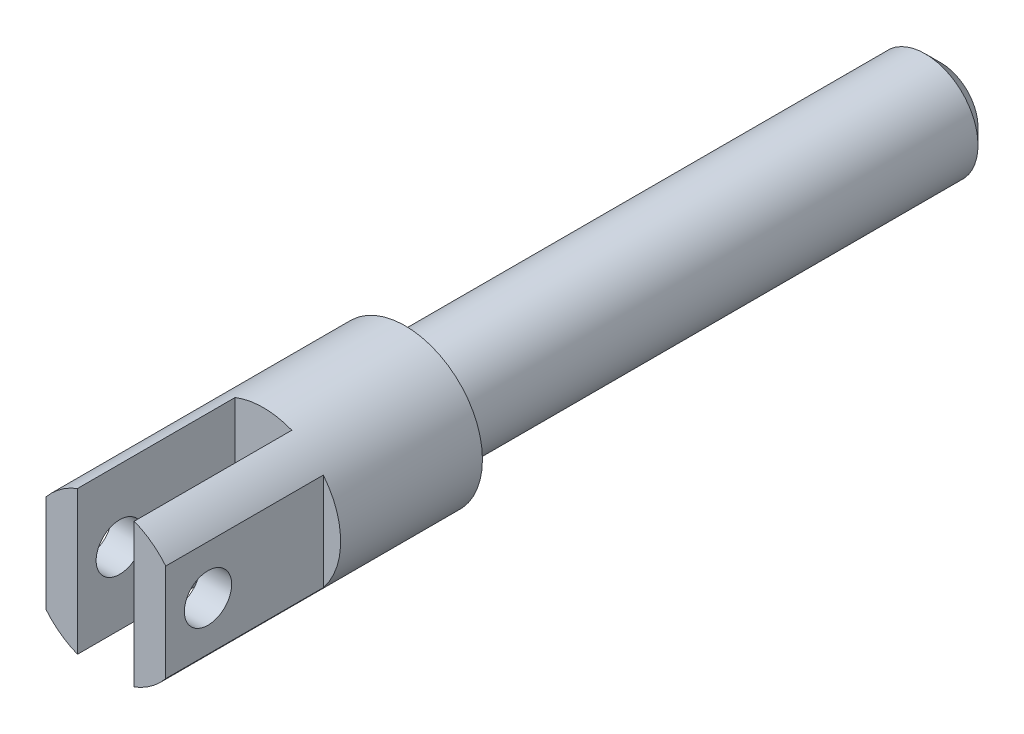
ISO-10303-21;
HEADER;
FILE_DESCRIPTION(('STEP AP214'),'2;1');
FILE_NAME('part.step','',(''),(''),'','','');
FILE_SCHEMA(('AUTOMOTIVE_DESIGN { 1 0 10303 214 1 1 1 1 }'));
ENDSEC;
DATA;
#1=APPLICATION_CONTEXT('core data for automotive mechanical design processes');
#2=APPLICATION_PROTOCOL_DEFINITION('international standard','automotive_design',2000,#1);
#3=PRODUCT_CONTEXT('',#1,'mechanical');
#4=PRODUCT('Part','Part','',(#3));
#5=PRODUCT_RELATED_PRODUCT_CATEGORY('part','',(#4));
#6=PRODUCT_DEFINITION_FORMATION('','',#4);
#7=PRODUCT_DEFINITION_CONTEXT('part definition',#1,'design');
#8=PRODUCT_DEFINITION('design','',#6,#7);
#9=PRODUCT_DEFINITION_SHAPE('','',#8);
#10=(LENGTH_UNIT() NAMED_UNIT(*) SI_UNIT(.MILLI.,.METRE.));
#11=(NAMED_UNIT(*) PLANE_ANGLE_UNIT() SI_UNIT($,.RADIAN.));
#12=(NAMED_UNIT(*) SI_UNIT($,.STERADIAN.) SOLID_ANGLE_UNIT());
#13=UNCERTAINTY_MEASURE_WITH_UNIT(LENGTH_MEASURE(1.E-05),#10,'distance_accuracy_value','');
#14=(GEOMETRIC_REPRESENTATION_CONTEXT(3) GLOBAL_UNCERTAINTY_ASSIGNED_CONTEXT((#13)) GLOBAL_UNIT_ASSIGNED_CONTEXT((#10,
#11,#12)) REPRESENTATION_CONTEXT('',''));
#15=CARTESIAN_POINT('',(0.,0.,0.));
#16=DIRECTION('',(0.,0.,1.));
#17=DIRECTION('',(1.,0.,0.));
#18=AXIS2_PLACEMENT_3D('',#15,#16,#17);
#19=CARTESIAN_POINT('',(0.,0.,0.));
#20=DIRECTION('',(0.,0.,1.));
#21=DIRECTION('',(1.,0.,0.));
#22=AXIS2_PLACEMENT_3D('',#19,#20,#21);
#23=PLANE('',#22);
#24=CARTESIAN_POINT('',(0.,0.,0.));
#25=DIRECTION('',(0.,0.,1.));
#26=DIRECTION('',(1.,0.,0.));
#27=AXIS2_PLACEMENT_3D('',#24,#25,#26);
#28=CIRCLE('',#27,4.9);
#29=CARTESIAN_POINT('',(4.9,0.,0.));
#30=VERTEX_POINT('',#29);
#31=EDGE_CURVE('E160',#30,#30,#28,.T.);
#32=ORIENTED_EDGE('',*,*,#31,.F.);
#33=EDGE_LOOP('',(#32));
#34=FACE_BOUND('',#33,.T.);
#35=CARTESIAN_POINT('',(0.,0.,0.));
#36=DIRECTION('',(0.,0.,1.));
#37=DIRECTION('',(1.,0.,0.));
#38=AXIS2_PLACEMENT_3D('',#35,#36,#37);
#39=CIRCLE('',#38,3.35);
#40=CARTESIAN_POINT('',(3.35,0.,0.));
#41=VERTEX_POINT('',#40);
#42=EDGE_CURVE('E181',#41,#41,#39,.F.);
#43=ORIENTED_EDGE('',*,*,#42,.F.);
#44=EDGE_LOOP('',(#43));
#45=FACE_BOUND('',#44,.T.);
#46=ADVANCED_FACE('F33',(#34,#45),#23,.F.);
#47=CARTESIAN_POINT('',(0.,0.,9.));
#48=DIRECTION('',(0.,0.,1.));
#49=DIRECTION('',(1.,0.,0.));
#50=AXIS2_PLACEMENT_3D('',#47,#48,#49);
#51=PLANE('',#50);
#52=CARTESIAN_POINT('',(0.,0.,9.));
#53=DIRECTION('',(0.,0.,1.));
#54=DIRECTION('',(1.,0.,0.));
#55=AXIS2_PLACEMENT_3D('',#52,#53,#54);
#56=CIRCLE('',#55,4.9);
#57=CARTESIAN_POINT('',(-3.8,3.09354165965161,9.));
#58=VERTEX_POINT('',#57);
#59=CARTESIAN_POINT('',(-3.8,-3.09354165965161,9.));
#60=VERTEX_POINT('',#59);
#61=EDGE_CURVE('E124',#58,#60,#56,.T.);
#62=ORIENTED_EDGE('',*,*,#61,.T.);
#63=DIRECTION('',(0.,-1.,0.));
#64=VECTOR('',#63,1.);
#65=CARTESIAN_POINT('',(-3.8,-3.09354165965161,9.));
#66=LINE('',#65,#64);
#67=EDGE_CURVE('E203',#58,#60,#66,.T.);
#68=ORIENTED_EDGE('',*,*,#67,.F.);
#69=EDGE_LOOP('',(#62,#68));
#70=FACE_BOUND('',#69,.T.);
#71=ADVANCED_FACE('F221',(#70),#51,.T.);
#72=CARTESIAN_POINT('',(1.8,4.55741154604234,9.));
#73=VERTEX_POINT('',#72);
#74=CARTESIAN_POINT('',(-1.8,4.55741154604234,9.));
#75=VERTEX_POINT('',#74);
#76=EDGE_CURVE('E173',#73,#75,#56,.T.);
#77=ORIENTED_EDGE('',*,*,#76,.T.);
#78=DIRECTION('',(0.,1.,0.));
#79=VECTOR('',#78,1.);
#80=CARTESIAN_POINT('',(-1.8,-4.55741154604234,9.));
#81=LINE('',#80,#79);
#82=CARTESIAN_POINT('',(-1.8,-4.55741154604234,9.));
#83=VERTEX_POINT('',#82);
#84=EDGE_CURVE('E117',#83,#75,#81,.T.);
#85=ORIENTED_EDGE('',*,*,#84,.F.);
#86=CARTESIAN_POINT('',(1.8,-4.55741154604234,9.));
#87=VERTEX_POINT('',#86);
#88=EDGE_CURVE('E174',#83,#87,#56,.T.);
#89=ORIENTED_EDGE('',*,*,#88,.T.);
#90=DIRECTION('',(0.,-1.,0.));
#91=VECTOR('',#90,1.);
#92=CARTESIAN_POINT('',(1.8,-4.55741154604234,9.));
#93=LINE('',#92,#91);
#94=EDGE_CURVE('E125',#73,#87,#93,.T.);
#95=ORIENTED_EDGE('',*,*,#94,.F.);
#96=EDGE_LOOP('',(#77,#85,#89,#95));
#97=FACE_BOUND('',#96,.T.);
#98=ADVANCED_FACE('F213',(#97),#51,.T.);
#99=DIRECTION('',(0.,1.,0.));
#100=VECTOR('',#99,1.);
#101=CARTESIAN_POINT('',(3.8,-3.09354165965161,9.));
#102=LINE('',#101,#100);
#103=CARTESIAN_POINT('',(3.8,-3.09354165965161,9.));
#104=VERTEX_POINT('',#103);
#105=CARTESIAN_POINT('',(3.8,3.09354165965161,9.));
#106=VERTEX_POINT('',#105);
#107=EDGE_CURVE('E55',#104,#106,#102,.T.);
#108=ORIENTED_EDGE('',*,*,#107,.F.);
#109=EDGE_CURVE('E148',#104,#106,#56,.T.);
#110=ORIENTED_EDGE('',*,*,#109,.T.);
#111=EDGE_LOOP('',(#108,#110));
#112=FACE_BOUND('',#111,.T.);
#113=ADVANCED_FACE('F228',(#112),#51,.T.);
#114=CARTESIAN_POINT('',(0.,0.,9.));
#115=DIRECTION('',(0.,0.,-1.));
#116=DIRECTION('',(-1.,0.,0.));
#117=AXIS2_PLACEMENT_3D('',#114,#115,#116);
#118=CYLINDRICAL_SURFACE('',#117,4.9);
#119=ORIENTED_EDGE('',*,*,#76,.F.);
#120=DIRECTION('',(0.,0.,-1.));
#121=VECTOR('',#120,1.);
#122=CARTESIAN_POINT('',(1.8,4.55741154604234,19.));
#123=LINE('',#122,#121);
#124=CARTESIAN_POINT('',(1.8,4.55741154604234,19.));
#125=VERTEX_POINT('',#124);
#126=EDGE_CURVE('E154',#125,#73,#123,.T.);
#127=ORIENTED_EDGE('',*,*,#126,.F.);
#128=CARTESIAN_POINT('',(0.,0.,19.));
#129=DIRECTION('',(0.,0.,1.));
#130=DIRECTION('',(1.,0.,0.));
#131=AXIS2_PLACEMENT_3D('',#128,#129,#130);
#132=CIRCLE('',#131,4.9);
#133=CARTESIAN_POINT('',(3.8,3.09354165965161,19.));
#134=VERTEX_POINT('',#133);
#135=EDGE_CURVE('E132',#134,#125,#132,.T.);
#136=ORIENTED_EDGE('',*,*,#135,.F.);
#137=DIRECTION('',(0.,0.,-1.));
#138=VECTOR('',#137,1.);
#139=CARTESIAN_POINT('',(3.8,3.09354165965161,19.));
#140=LINE('',#139,#138);
#141=EDGE_CURVE('E141',#134,#106,#140,.T.);
#142=ORIENTED_EDGE('',*,*,#141,.T.);
#143=ORIENTED_EDGE('',*,*,#109,.F.);
#144=DIRECTION('',(0.,0.,-1.));
#145=VECTOR('',#144,1.);
#146=CARTESIAN_POINT('',(3.8,-3.09354165965161,19.));
#147=LINE('',#146,#145);
#148=CARTESIAN_POINT('',(3.8,-3.09354165965161,19.));
#149=VERTEX_POINT('',#148);
#150=EDGE_CURVE('E155',#149,#104,#147,.T.);
#151=ORIENTED_EDGE('',*,*,#150,.F.);
#152=CARTESIAN_POINT('',(0.,0.,19.));
#153=DIRECTION('',(0.,0.,1.));
#154=DIRECTION('',(1.,0.,0.));
#155=AXIS2_PLACEMENT_3D('',#152,#153,#154);
#156=CIRCLE('',#155,4.9);
#157=CARTESIAN_POINT('',(1.8,-4.55741154604234,19.));
#158=VERTEX_POINT('',#157);
#159=EDGE_CURVE('E137',#158,#149,#156,.T.);
#160=ORIENTED_EDGE('',*,*,#159,.F.);
#161=DIRECTION('',(0.,0.,-1.));
#162=VECTOR('',#161,1.);
#163=CARTESIAN_POINT('',(1.8,-4.55741154604234,19.));
#164=LINE('',#163,#162);
#165=EDGE_CURVE('E151',#158,#87,#164,.T.);
#166=ORIENTED_EDGE('',*,*,#165,.T.);
#167=ORIENTED_EDGE('',*,*,#88,.F.);
#168=DIRECTION('',(0.,0.,-1.));
#169=VECTOR('',#168,1.);
#170=CARTESIAN_POINT('',(-1.8,-4.55741154604234,19.));
#171=LINE('',#170,#169);
#172=CARTESIAN_POINT('',(-1.8,-4.55741154604234,19.));
#173=VERTEX_POINT('',#172);
#174=EDGE_CURVE('E48',#173,#83,#171,.T.);
#175=ORIENTED_EDGE('',*,*,#174,.F.);
#176=CARTESIAN_POINT('',(0.,0.,19.));
#177=DIRECTION('',(0.,0.,1.));
#178=DIRECTION('',(1.,0.,0.));
#179=AXIS2_PLACEMENT_3D('',#176,#177,#178);
#180=CIRCLE('',#179,4.9);
#181=CARTESIAN_POINT('',(-3.8,-3.09354165965161,19.));
#182=VERTEX_POINT('',#181);
#183=EDGE_CURVE('E108',#182,#173,#180,.T.);
#184=ORIENTED_EDGE('',*,*,#183,.F.);
#185=DIRECTION('',(0.,0.,-1.));
#186=VECTOR('',#185,1.);
#187=CARTESIAN_POINT('',(-3.8,-3.09354165965161,19.));
#188=LINE('',#187,#186);
#189=EDGE_CURVE('E105',#182,#60,#188,.T.);
#190=ORIENTED_EDGE('',*,*,#189,.T.);
#191=ORIENTED_EDGE('',*,*,#61,.F.);
#192=DIRECTION('',(0.,0.,-1.));
#193=VECTOR('',#192,1.);
#194=CARTESIAN_POINT('',(-3.8,3.09354165965161,19.));
#195=LINE('',#194,#193);
#196=CARTESIAN_POINT('',(-3.8,3.09354165965161,19.));
#197=VERTEX_POINT('',#196);
#198=EDGE_CURVE('E102',#197,#58,#195,.T.);
#199=ORIENTED_EDGE('',*,*,#198,.F.);
#200=CARTESIAN_POINT('',(0.,0.,19.));
#201=DIRECTION('',(0.,0.,1.));
#202=DIRECTION('',(1.,0.,0.));
#203=AXIS2_PLACEMENT_3D('',#200,#201,#202);
#204=CIRCLE('',#203,4.9);
#205=CARTESIAN_POINT('',(-1.8,4.55741154604234,19.));
#206=VERTEX_POINT('',#205);
#207=EDGE_CURVE('E109',#206,#197,#204,.T.);
#208=ORIENTED_EDGE('',*,*,#207,.F.);
#209=DIRECTION('',(0.,0.,-1.));
#210=VECTOR('',#209,1.);
#211=CARTESIAN_POINT('',(-1.8,4.55741154604234,19.));
#212=LINE('',#211,#210);
#213=EDGE_CURVE('E207',#206,#75,#212,.T.);
#214=ORIENTED_EDGE('',*,*,#213,.T.);
#215=EDGE_LOOP('',(#119,#127,#136,#142,#143,#151,#160,#166,#167,#175,#184,#190,#191,#199,#208,#214));
#216=FACE_BOUND('',#215,.T.);
#217=ORIENTED_EDGE('',*,*,#31,.T.);
#218=EDGE_LOOP('',(#217));
#219=FACE_BOUND('',#218,.T.);
#220=ADVANCED_FACE('F121',(#216,#219),#118,.T.);
#221=CARTESIAN_POINT('',(1.8,-4.55741154604234,19.));
#222=DIRECTION('',(1.,0.,0.));
#223=DIRECTION('',(0.,0.,-1.));
#224=AXIS2_PLACEMENT_3D('',#221,#222,#223);
#225=PLANE('',#224);
#226=CARTESIAN_POINT('',(1.8,0.,16.3188145856226));
#227=DIRECTION('',(1.,0.,0.));
#228=DIRECTION('',(0.,0.,-1.));
#229=AXIS2_PLACEMENT_3D('',#226,#227,#228);
#230=CIRCLE('',#229,1.5);
#231=CARTESIAN_POINT('',(1.8,0.,14.8188145856226));
#232=VERTEX_POINT('',#231);
#233=EDGE_CURVE('E195',#232,#232,#230,.T.);
#234=ORIENTED_EDGE('',*,*,#233,.T.);
#235=EDGE_LOOP('',(#234));
#236=FACE_BOUND('',#235,.T.);
#237=ORIENTED_EDGE('',*,*,#94,.T.);
#238=ORIENTED_EDGE('',*,*,#165,.F.);
#239=DIRECTION('',(0.,-1.,0.));
#240=VECTOR('',#239,1.);
#241=CARTESIAN_POINT('',(1.8,-4.55741154604234,19.));
#242=LINE('',#241,#240);
#243=EDGE_CURVE('E135',#125,#158,#242,.T.);
#244=ORIENTED_EDGE('',*,*,#243,.F.);
#245=ORIENTED_EDGE('',*,*,#126,.T.);
#246=EDGE_LOOP('',(#237,#238,#244,#245));
#247=FACE_BOUND('',#246,.T.);
#248=ADVANCED_FACE('F231',(#236,#247),#225,.F.);
#249=CARTESIAN_POINT('',(3.8,-3.09354165965161,19.));
#250=DIRECTION('',(-1.,0.,0.));
#251=DIRECTION('',(0.,0.,1.));
#252=AXIS2_PLACEMENT_3D('',#249,#250,#251);
#253=PLANE('',#252);
#254=CARTESIAN_POINT('',(3.8,0.,16.3188145856226));
#255=DIRECTION('',(-1.,0.,0.));
#256=DIRECTION('',(0.,0.,1.));
#257=AXIS2_PLACEMENT_3D('',#254,#255,#256);
#258=CIRCLE('',#257,1.5);
#259=CARTESIAN_POINT('',(3.8,0.,17.8188145856226));
#260=VERTEX_POINT('',#259);
#261=EDGE_CURVE('E190',#260,#260,#258,.T.);
#262=ORIENTED_EDGE('',*,*,#261,.T.);
#263=EDGE_LOOP('',(#262));
#264=FACE_BOUND('',#263,.T.);
#265=ORIENTED_EDGE('',*,*,#107,.T.);
#266=ORIENTED_EDGE('',*,*,#141,.F.);
#267=DIRECTION('',(0.,1.,0.));
#268=VECTOR('',#267,1.);
#269=CARTESIAN_POINT('',(3.8,-3.09354165965161,19.));
#270=LINE('',#269,#268);
#271=EDGE_CURVE('E139',#149,#134,#270,.T.);
#272=ORIENTED_EDGE('',*,*,#271,.F.);
#273=ORIENTED_EDGE('',*,*,#150,.T.);
#274=EDGE_LOOP('',(#265,#266,#272,#273));
#275=FACE_BOUND('',#274,.T.);
#276=ADVANCED_FACE('F236',(#264,#275),#253,.F.);
#277=CARTESIAN_POINT('',(0.,0.,19.));
#278=DIRECTION('',(0.,0.,1.));
#279=DIRECTION('',(1.,0.,0.));
#280=AXIS2_PLACEMENT_3D('',#277,#278,#279);
#281=PLANE('',#280);
#282=ORIENTED_EDGE('',*,*,#135,.T.);
#283=ORIENTED_EDGE('',*,*,#243,.T.);
#284=ORIENTED_EDGE('',*,*,#159,.T.);
#285=ORIENTED_EDGE('',*,*,#271,.T.);
#286=EDGE_LOOP('',(#282,#283,#284,#285));
#287=FACE_BOUND('',#286,.T.);
#288=ADVANCED_FACE('F283',(#287),#281,.T.);
#289=CARTESIAN_POINT('',(-3.8,-3.09354165965161,19.));
#290=DIRECTION('',(1.,0.,0.));
#291=DIRECTION('',(0.,0.,-1.));
#292=AXIS2_PLACEMENT_3D('',#289,#290,#291);
#293=PLANE('',#292);
#294=CARTESIAN_POINT('',(-3.8,0.,16.3188145856226));
#295=DIRECTION('',(-1.,0.,0.));
#296=DIRECTION('',(0.,0.,1.));
#297=AXIS2_PLACEMENT_3D('',#294,#295,#296);
#298=CIRCLE('',#297,1.5);
#299=CARTESIAN_POINT('',(-3.8,0.,17.8188145856226));
#300=VERTEX_POINT('',#299);
#301=EDGE_CURVE('E191',#300,#300,#298,.T.);
#302=ORIENTED_EDGE('',*,*,#301,.F.);
#303=EDGE_LOOP('',(#302));
#304=FACE_BOUND('',#303,.T.);
#305=ORIENTED_EDGE('',*,*,#67,.T.);
#306=ORIENTED_EDGE('',*,*,#189,.F.);
#307=DIRECTION('',(0.,-1.,0.));
#308=VECTOR('',#307,1.);
#309=CARTESIAN_POINT('',(-3.8,-3.09354165965161,19.));
#310=LINE('',#309,#308);
#311=EDGE_CURVE('E98',#197,#182,#310,.T.);
#312=ORIENTED_EDGE('',*,*,#311,.F.);
#313=ORIENTED_EDGE('',*,*,#198,.T.);
#314=EDGE_LOOP('',(#305,#306,#312,#313));
#315=FACE_BOUND('',#314,.T.);
#316=ADVANCED_FACE('F100',(#304,#315),#293,.F.);
#317=CARTESIAN_POINT('',(-1.8,-4.55741154604234,19.));
#318=DIRECTION('',(-1.,0.,0.));
#319=DIRECTION('',(0.,0.,1.));
#320=AXIS2_PLACEMENT_3D('',#317,#318,#319);
#321=PLANE('',#320);
#322=CARTESIAN_POINT('',(-1.8,0.,16.3188145856226));
#323=DIRECTION('',(-1.,0.,0.));
#324=DIRECTION('',(0.,0.,1.));
#325=AXIS2_PLACEMENT_3D('',#322,#323,#324);
#326=CIRCLE('',#325,1.5);
#327=CARTESIAN_POINT('',(-1.8,0.,17.8188145856226));
#328=VERTEX_POINT('',#327);
#329=EDGE_CURVE('E188',#328,#328,#326,.T.);
#330=ORIENTED_EDGE('',*,*,#329,.T.);
#331=EDGE_LOOP('',(#330));
#332=FACE_BOUND('',#331,.T.);
#333=ORIENTED_EDGE('',*,*,#84,.T.);
#334=ORIENTED_EDGE('',*,*,#213,.F.);
#335=DIRECTION('',(0.,1.,0.));
#336=VECTOR('',#335,1.);
#337=CARTESIAN_POINT('',(-1.8,-4.55741154604234,19.));
#338=LINE('',#337,#336);
#339=EDGE_CURVE('E113',#173,#206,#338,.T.);
#340=ORIENTED_EDGE('',*,*,#339,.F.);
#341=ORIENTED_EDGE('',*,*,#174,.T.);
#342=EDGE_LOOP('',(#333,#334,#340,#341));
#343=FACE_BOUND('',#342,.T.);
#344=ADVANCED_FACE('F211',(#332,#343),#321,.F.);
#345=CARTESIAN_POINT('',(0.,0.,19.));
#346=DIRECTION('',(0.,0.,1.));
#347=DIRECTION('',(1.,0.,0.));
#348=AXIS2_PLACEMENT_3D('',#345,#346,#347);
#349=PLANE('',#348);
#350=ORIENTED_EDGE('',*,*,#207,.T.);
#351=ORIENTED_EDGE('',*,*,#311,.T.);
#352=ORIENTED_EDGE('',*,*,#183,.T.);
#353=ORIENTED_EDGE('',*,*,#339,.T.);
#354=EDGE_LOOP('',(#350,#351,#352,#353));
#355=FACE_BOUND('',#354,.T.);
#356=ADVANCED_FACE('F112',(#355),#349,.T.);
#357=CARTESIAN_POINT('',(4.900025,0.,16.3188145856226));
#358=DIRECTION('',(-1.,0.,0.));
#359=DIRECTION('',(0.,0.,1.));
#360=AXIS2_PLACEMENT_3D('',#357,#358,#359);
#361=CYLINDRICAL_SURFACE('',#360,1.5);
#362=ORIENTED_EDGE('',*,*,#301,.T.);
#363=EDGE_LOOP('',(#362));
#364=FACE_BOUND('',#363,.T.);
#365=ORIENTED_EDGE('',*,*,#329,.F.);
#366=EDGE_LOOP('',(#365));
#367=FACE_BOUND('',#366,.T.);
#368=ADVANCED_FACE('F314',(#364,#367),#361,.F.);
#369=ORIENTED_EDGE('',*,*,#261,.F.);
#370=EDGE_LOOP('',(#369));
#371=FACE_BOUND('',#370,.T.);
#372=ORIENTED_EDGE('',*,*,#233,.F.);
#373=EDGE_LOOP('',(#372));
#374=FACE_BOUND('',#373,.T.);
#375=ADVANCED_FACE('F321',(#371,#374),#361,.F.);
#376=CARTESIAN_POINT('',(0.,0.,-34.));
#377=DIRECTION('',(0.,0.,1.));
#378=DIRECTION('',(1.,0.,0.));
#379=AXIS2_PLACEMENT_3D('',#376,#377,#378);
#380=CYLINDRICAL_SURFACE('',#379,3.35);
#381=CARTESIAN_POINT('',(0.,0.,-33.));
#382=DIRECTION('',(0.,0.,-1.));
#383=DIRECTION('',(-1.,0.,0.));
#384=AXIS2_PLACEMENT_3D('',#381,#382,#383);
#385=CIRCLE('',#384,3.35);
#386=CARTESIAN_POINT('',(-3.35,0.,-33.));
#387=VERTEX_POINT('',#386);
#388=EDGE_CURVE('E11',#387,#387,#385,.F.);
#389=ORIENTED_EDGE('',*,*,#388,.T.);
#390=EDGE_LOOP('',(#389));
#391=FACE_BOUND('',#390,.T.);
#392=ORIENTED_EDGE('',*,*,#42,.T.);
#393=EDGE_LOOP('',(#392));
#394=FACE_BOUND('',#393,.T.);
#395=ADVANCED_FACE('F329',(#391,#394),#380,.T.);
#396=CARTESIAN_POINT('',(0.,0.,-34.));
#397=DIRECTION('',(0.,0.,-1.));
#398=DIRECTION('',(-1.,0.,0.));
#399=AXIS2_PLACEMENT_3D('',#396,#397,#398);
#400=PLANE('',#399);
#401=CARTESIAN_POINT('',(0.,0.,-34.));
#402=DIRECTION('',(0.,0.,-1.));
#403=DIRECTION('',(-1.,0.,0.));
#404=AXIS2_PLACEMENT_3D('',#401,#402,#403);
#405=CIRCLE('',#404,2.35);
#406=CARTESIAN_POINT('',(-2.35,0.,-34.));
#407=VERTEX_POINT('',#406);
#408=EDGE_CURVE('E41',#407,#407,#405,.T.);
#409=ORIENTED_EDGE('',*,*,#408,.T.);
#410=EDGE_LOOP('',(#409));
#411=FACE_BOUND('',#410,.T.);
#412=ADVANCED_FACE('F341',(#411),#400,.T.);
#413=CARTESIAN_POINT('',(0.,0.,-34.));
#414=DIRECTION('',(0.,0.,1.));
#415=DIRECTION('',(1.,0.,0.));
#416=AXIS2_PLACEMENT_3D('',#413,#414,#415);
#417=CONICAL_SURFACE('',#416,2.35,0.785398163397446);
#418=ORIENTED_EDGE('',*,*,#388,.F.);
#419=EDGE_LOOP('',(#418));
#420=FACE_BOUND('',#419,.T.);
#421=ORIENTED_EDGE('',*,*,#408,.F.);
#422=EDGE_LOOP('',(#421));
#423=FACE_BOUND('',#422,.T.);
#424=ADVANCED_FACE('F35',(#420,#423),#417,.T.);
#425=CLOSED_SHELL('',(#46,#71,#98,#113,#220,#248,#276,#288,#316,#344,#356,#368,#375,#395,#412,#424));
#426=MANIFOLD_SOLID_BREP('B2',#425);
#427=ADVANCED_BREP_SHAPE_REPRESENTATION('',(#18,#426),#14);
#428=SHAPE_DEFINITION_REPRESENTATION(#9,#427);
ENDSEC;
END-ISO-10303-21;
